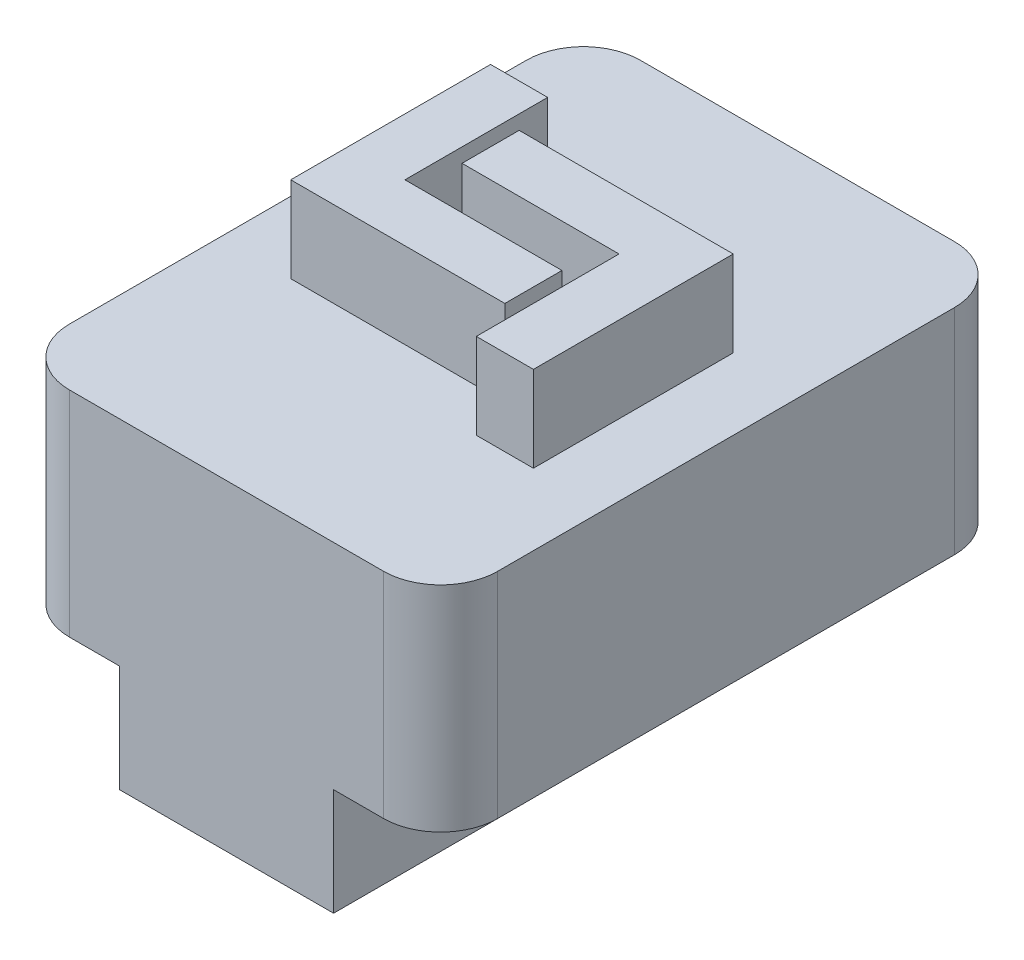
ISO-10303-21;
HEADER;
FILE_DESCRIPTION(('STEP AP214'),'2;1');
FILE_NAME('part.step','',(''),(''),'','','');
FILE_SCHEMA(('AUTOMOTIVE_DESIGN { 1 0 10303 214 1 1 1 1 }'));
ENDSEC;
DATA;
#1=APPLICATION_CONTEXT('core data for automotive mechanical design processes');
#2=APPLICATION_PROTOCOL_DEFINITION('international standard','automotive_design',2000,#1);
#3=PRODUCT_CONTEXT('',#1,'mechanical');
#4=PRODUCT('Part','Part','',(#3));
#5=PRODUCT_RELATED_PRODUCT_CATEGORY('part','',(#4));
#6=PRODUCT_DEFINITION_FORMATION('','',#4);
#7=PRODUCT_DEFINITION_CONTEXT('part definition',#1,'design');
#8=PRODUCT_DEFINITION('design','',#6,#7);
#9=PRODUCT_DEFINITION_SHAPE('','',#8);
#10=(LENGTH_UNIT() NAMED_UNIT(*) SI_UNIT(.MILLI.,.METRE.));
#11=(NAMED_UNIT(*) PLANE_ANGLE_UNIT() SI_UNIT($,.RADIAN.));
#12=(NAMED_UNIT(*) SI_UNIT($,.STERADIAN.) SOLID_ANGLE_UNIT());
#13=UNCERTAINTY_MEASURE_WITH_UNIT(LENGTH_MEASURE(1.E-05),#10,'distance_accuracy_value','');
#14=(GEOMETRIC_REPRESENTATION_CONTEXT(3) GLOBAL_UNCERTAINTY_ASSIGNED_CONTEXT((#13)) GLOBAL_UNIT_ASSIGNED_CONTEXT((#10,
#11,#12)) REPRESENTATION_CONTEXT('',''));
#15=CARTESIAN_POINT('',(0.,0.,0.));
#16=DIRECTION('',(0.,0.,1.));
#17=DIRECTION('',(1.,0.,0.));
#18=AXIS2_PLACEMENT_3D('',#15,#16,#17);
#19=CARTESIAN_POINT('',(0.,0.,80.));
#20=DIRECTION('',(1.,0.,0.));
#21=DIRECTION('',(0.,0.,-1.));
#22=AXIS2_PLACEMENT_3D('',#19,#20,#21);
#23=PLANE('',#22);
#24=DIRECTION('',(0.,-1.,0.));
#25=VECTOR('',#24,1.);
#26=CARTESIAN_POINT('',(0.,0.,7.99999999999999));
#27=LINE('',#26,#25);
#28=CARTESIAN_POINT('',(0.,45.,7.99999999999999));
#29=VERTEX_POINT('',#28);
#30=CARTESIAN_POINT('',(0.,15.,7.99999999999999));
#31=VERTEX_POINT('',#30);
#32=EDGE_CURVE('E416',#29,#31,#27,.T.);
#33=ORIENTED_EDGE('',*,*,#32,.T.);
#34=DIRECTION('',(0.,0.,1.));
#35=VECTOR('',#34,1.);
#36=CARTESIAN_POINT('',(0.,15.,0.));
#37=LINE('',#36,#35);
#38=CARTESIAN_POINT('',(0.,15.,72.));
#39=VERTEX_POINT('',#38);
#40=EDGE_CURVE('E369',#31,#39,#37,.T.);
#41=ORIENTED_EDGE('',*,*,#40,.T.);
#42=DIRECTION('',(0.,-1.,0.));
#43=VECTOR('',#42,1.);
#44=CARTESIAN_POINT('',(0.,0.,72.));
#45=LINE('',#44,#43);
#46=CARTESIAN_POINT('',(0.,45.,72.));
#47=VERTEX_POINT('',#46);
#48=EDGE_CURVE('E414',#39,#47,#45,.F.);
#49=ORIENTED_EDGE('',*,*,#48,.T.);
#50=DIRECTION('',(0.,0.,-1.));
#51=VECTOR('',#50,1.);
#52=CARTESIAN_POINT('',(0.,45.,80.));
#53=LINE('',#52,#51);
#54=EDGE_CURVE('E408',#47,#29,#53,.T.);
#55=ORIENTED_EDGE('',*,*,#54,.T.);
#56=EDGE_LOOP('',(#33,#41,#49,#55));
#57=FACE_BOUND('',#56,.T.);
#58=ADVANCED_FACE('F84',(#57),#23,.F.);
#59=CARTESIAN_POINT('',(0.,0.,80.));
#60=DIRECTION('',(0.,1.,0.));
#61=DIRECTION('',(0.,0.,1.));
#62=AXIS2_PLACEMENT_3D('',#59,#60,#61);
#63=PLANE('',#62);
#64=CARTESIAN_POINT('',(18.8630681963119,0.,28.8630681963119));
#65=DIRECTION('',(0.,-1.,0.));
#66=DIRECTION('',(0.,0.,-1.));
#67=AXIS2_PLACEMENT_3D('',#64,#65,#66);
#68=CIRCLE('',#67,2.5);
#69=CARTESIAN_POINT('',(18.8630681963119,0.,26.3630681963119));
#70=VERTEX_POINT('',#69);
#71=EDGE_CURVE('E333',#70,#70,#68,.T.);
#72=ORIENTED_EDGE('',*,*,#71,.F.);
#73=EDGE_LOOP('',(#72));
#74=FACE_BOUND('',#73,.T.);
#75=CARTESIAN_POINT('',(18.8630681963119,0.,51.1369318036881));
#76=DIRECTION('',(0.,-1.,0.));
#77=DIRECTION('',(0.,0.,-1.));
#78=AXIS2_PLACEMENT_3D('',#75,#76,#77);
#79=CIRCLE('',#78,2.5);
#80=CARTESIAN_POINT('',(18.8630681963119,0.,48.6369318036881));
#81=VERTEX_POINT('',#80);
#82=EDGE_CURVE('E339',#81,#81,#79,.T.);
#83=ORIENTED_EDGE('',*,*,#82,.F.);
#84=EDGE_LOOP('',(#83));
#85=FACE_BOUND('',#84,.T.);
#86=CARTESIAN_POINT('',(41.1369318036881,0.,28.8630681963119));
#87=DIRECTION('',(0.,-1.,0.));
#88=DIRECTION('',(0.,0.,-1.));
#89=AXIS2_PLACEMENT_3D('',#86,#87,#88);
#90=CIRCLE('',#89,2.49999999999999);
#91=CARTESIAN_POINT('',(41.1369318036881,0.,26.3630681963119));
#92=VERTEX_POINT('',#91);
#93=EDGE_CURVE('E345',#92,#92,#90,.T.);
#94=ORIENTED_EDGE('',*,*,#93,.F.);
#95=EDGE_LOOP('',(#94));
#96=FACE_BOUND('',#95,.T.);
#97=CARTESIAN_POINT('',(41.1369318036881,0.,51.1369318036881));
#98=DIRECTION('',(0.,-1.,0.));
#99=DIRECTION('',(0.,0.,-1.));
#100=AXIS2_PLACEMENT_3D('',#97,#98,#99);
#101=CIRCLE('',#100,2.5);
#102=CARTESIAN_POINT('',(41.1369318036881,0.,48.6369318036881));
#103=VERTEX_POINT('',#102);
#104=EDGE_CURVE('E351',#103,#103,#101,.T.);
#105=ORIENTED_EDGE('',*,*,#104,.F.);
#106=EDGE_LOOP('',(#105));
#107=FACE_BOUND('',#106,.T.);
#108=DIRECTION('',(1.,0.,0.));
#109=VECTOR('',#108,1.);
#110=CARTESIAN_POINT('',(0.,0.,80.));
#111=LINE('',#110,#109);
#112=CARTESIAN_POINT('',(15.,0.,80.));
#113=VERTEX_POINT('',#112);
#114=CARTESIAN_POINT('',(45.,0.,80.));
#115=VERTEX_POINT('',#114);
#116=EDGE_CURVE('E403',#113,#115,#111,.T.);
#117=ORIENTED_EDGE('',*,*,#116,.F.);
#118=DIRECTION('',(0.,0.,1.));
#119=VECTOR('',#118,1.);
#120=CARTESIAN_POINT('',(15.,0.,0.));
#121=LINE('',#120,#119);
#122=CARTESIAN_POINT('',(15.,0.,0.));
#123=VERTEX_POINT('',#122);
#124=EDGE_CURVE('E368',#123,#113,#121,.T.);
#125=ORIENTED_EDGE('',*,*,#124,.F.);
#126=DIRECTION('',(1.,0.,0.));
#127=VECTOR('',#126,1.);
#128=CARTESIAN_POINT('',(0.,0.,0.));
#129=LINE('',#128,#127);
#130=CARTESIAN_POINT('',(45.,0.,0.));
#131=VERTEX_POINT('',#130);
#132=EDGE_CURVE('E398',#123,#131,#129,.T.);
#133=ORIENTED_EDGE('',*,*,#132,.T.);
#134=DIRECTION('',(0.,0.,1.));
#135=VECTOR('',#134,1.);
#136=CARTESIAN_POINT('',(45.,0.,0.));
#137=LINE('',#136,#135);
#138=EDGE_CURVE('E388',#131,#115,#137,.T.);
#139=ORIENTED_EDGE('',*,*,#138,.T.);
#140=EDGE_LOOP('',(#117,#125,#133,#139));
#141=FACE_BOUND('',#140,.T.);
#142=ADVANCED_FACE('F486',(#74,#85,#96,#107,#141),#63,.F.);
#143=CARTESIAN_POINT('',(60.,0.,80.));
#144=DIRECTION('',(-1.,0.,0.));
#145=DIRECTION('',(0.,0.,1.));
#146=AXIS2_PLACEMENT_3D('',#143,#144,#145);
#147=PLANE('',#146);
#148=DIRECTION('',(0.,1.,0.));
#149=VECTOR('',#148,1.);
#150=CARTESIAN_POINT('',(60.,0.,72.));
#151=LINE('',#150,#149);
#152=CARTESIAN_POINT('',(60.,45.,72.));
#153=VERTEX_POINT('',#152);
#154=CARTESIAN_POINT('',(60.,15.,72.));
#155=VERTEX_POINT('',#154);
#156=EDGE_CURVE('E432',#153,#155,#151,.F.);
#157=ORIENTED_EDGE('',*,*,#156,.T.);
#158=DIRECTION('',(0.,0.,1.));
#159=VECTOR('',#158,1.);
#160=CARTESIAN_POINT('',(60.,15.,0.));
#161=LINE('',#160,#159);
#162=CARTESIAN_POINT('',(60.,15.,7.99999999999999));
#163=VERTEX_POINT('',#162);
#164=EDGE_CURVE('E393',#163,#155,#161,.T.);
#165=ORIENTED_EDGE('',*,*,#164,.F.);
#166=DIRECTION('',(0.,1.,0.));
#167=VECTOR('',#166,1.);
#168=CARTESIAN_POINT('',(60.,45.,7.99999999999999));
#169=LINE('',#168,#167);
#170=CARTESIAN_POINT('',(60.,45.,7.99999999999999));
#171=VERTEX_POINT('',#170);
#172=EDGE_CURVE('E435',#163,#171,#169,.T.);
#173=ORIENTED_EDGE('',*,*,#172,.T.);
#174=DIRECTION('',(0.,0.,-1.));
#175=VECTOR('',#174,1.);
#176=CARTESIAN_POINT('',(60.,45.,80.));
#177=LINE('',#176,#175);
#178=EDGE_CURVE('E411',#153,#171,#177,.T.);
#179=ORIENTED_EDGE('',*,*,#178,.F.);
#180=EDGE_LOOP('',(#157,#165,#173,#179));
#181=FACE_BOUND('',#180,.T.);
#182=ADVANCED_FACE('F498',(#181),#147,.F.);
#183=CARTESIAN_POINT('',(0.,45.,80.));
#184=DIRECTION('',(0.,-1.,0.));
#185=DIRECTION('',(0.,0.,-1.));
#186=AXIS2_PLACEMENT_3D('',#183,#184,#185);
#187=PLANE('',#186);
#188=DIRECTION('',(0.,0.,1.));
#189=VECTOR('',#188,1.);
#190=CARTESIAN_POINT('',(50.,45.,29.));
#191=LINE('',#190,#189);
#192=CARTESIAN_POINT('',(50.,45.,29.));
#193=VERTEX_POINT('',#192);
#194=CARTESIAN_POINT('',(50.,45.,57.));
#195=VERTEX_POINT('',#194);
#196=EDGE_CURVE('E103',#193,#195,#191,.T.);
#197=ORIENTED_EDGE('',*,*,#196,.T.);
#198=DIRECTION('',(-1.,0.,0.));
#199=VECTOR('',#198,1.);
#200=CARTESIAN_POINT('',(-47.9231672867576,45.,56.9999999999999));
#201=LINE('',#200,#199);
#202=CARTESIAN_POINT('',(42.,45.,57.));
#203=VERTEX_POINT('',#202);
#204=EDGE_CURVE('E98',#195,#203,#201,.T.);
#205=ORIENTED_EDGE('',*,*,#204,.T.);
#206=DIRECTION('',(0.,0.,1.));
#207=VECTOR('',#206,1.);
#208=CARTESIAN_POINT('',(42.,45.,40.));
#209=LINE('',#208,#207);
#210=CARTESIAN_POINT('',(42.,45.,37.));
#211=VERTEX_POINT('',#210);
#212=EDGE_CURVE('E270',#211,#203,#209,.T.);
#213=ORIENTED_EDGE('',*,*,#212,.F.);
#214=DIRECTION('',(1.,0.,0.));
#215=VECTOR('',#214,1.);
#216=CARTESIAN_POINT('',(20.,45.,37.));
#217=LINE('',#216,#215);
#218=CARTESIAN_POINT('',(20.,45.,37.));
#219=VERTEX_POINT('',#218);
#220=EDGE_CURVE('E274',#219,#211,#217,.T.);
#221=ORIENTED_EDGE('',*,*,#220,.F.);
#222=DIRECTION('',(0.,0.,1.));
#223=VECTOR('',#222,1.);
#224=CARTESIAN_POINT('',(20.,45.,29.));
#225=LINE('',#224,#223);
#226=CARTESIAN_POINT('',(20.,45.,29.));
#227=VERTEX_POINT('',#226);
#228=EDGE_CURVE('E282',#227,#219,#225,.T.);
#229=ORIENTED_EDGE('',*,*,#228,.F.);
#230=DIRECTION('',(1.,0.,0.));
#231=VECTOR('',#230,1.);
#232=CARTESIAN_POINT('',(20.,45.,29.));
#233=LINE('',#232,#231);
#234=EDGE_CURVE('E251',#227,#193,#233,.T.);
#235=ORIENTED_EDGE('',*,*,#234,.T.);
#236=EDGE_LOOP('',(#197,#205,#213,#221,#229,#235));
#237=FACE_BOUND('',#236,.T.);
#238=DIRECTION('',(1.,0.,0.));
#239=VECTOR('',#238,1.);
#240=CARTESIAN_POINT('',(-47.9231672867576,45.,51.));
#241=LINE('',#240,#239);
#242=CARTESIAN_POINT('',(10.,45.,51.));
#243=VERTEX_POINT('',#242);
#244=CARTESIAN_POINT('',(40.,45.,51.));
#245=VERTEX_POINT('',#244);
#246=EDGE_CURVE('E290',#243,#245,#241,.T.);
#247=ORIENTED_EDGE('',*,*,#246,.F.);
#248=DIRECTION('',(0.,0.,-1.));
#249=VECTOR('',#248,1.);
#250=CARTESIAN_POINT('',(10.,45.,40.));
#251=LINE('',#250,#249);
#252=CARTESIAN_POINT('',(10.,45.,23.));
#253=VERTEX_POINT('',#252);
#254=EDGE_CURVE('E287',#243,#253,#251,.T.);
#255=ORIENTED_EDGE('',*,*,#254,.T.);
#256=DIRECTION('',(1.,0.,0.));
#257=VECTOR('',#256,1.);
#258=CARTESIAN_POINT('',(-47.9231672867576,45.,23.));
#259=LINE('',#258,#257);
#260=CARTESIAN_POINT('',(18.,45.,23.));
#261=VERTEX_POINT('',#260);
#262=EDGE_CURVE('E301',#253,#261,#259,.T.);
#263=ORIENTED_EDGE('',*,*,#262,.T.);
#264=DIRECTION('',(0.,0.,-1.));
#265=VECTOR('',#264,1.);
#266=CARTESIAN_POINT('',(18.,45.,40.));
#267=LINE('',#266,#265);
#268=CARTESIAN_POINT('',(18.,45.,43.));
#269=VERTEX_POINT('',#268);
#270=EDGE_CURVE('E299',#269,#261,#267,.T.);
#271=ORIENTED_EDGE('',*,*,#270,.F.);
#272=DIRECTION('',(1.,0.,0.));
#273=VECTOR('',#272,1.);
#274=CARTESIAN_POINT('',(-47.9231672867576,45.,43.));
#275=LINE('',#274,#273);
#276=CARTESIAN_POINT('',(40.,45.,43.));
#277=VERTEX_POINT('',#276);
#278=EDGE_CURVE('E296',#269,#277,#275,.T.);
#279=ORIENTED_EDGE('',*,*,#278,.T.);
#280=DIRECTION('',(0.,0.,1.));
#281=VECTOR('',#280,1.);
#282=CARTESIAN_POINT('',(40.,45.,40.));
#283=LINE('',#282,#281);
#284=EDGE_CURVE('E293',#277,#245,#283,.T.);
#285=ORIENTED_EDGE('',*,*,#284,.T.);
#286=EDGE_LOOP('',(#247,#255,#263,#271,#279,#285));
#287=FACE_BOUND('',#286,.T.);
#288=DIRECTION('',(-1.,0.,0.));
#289=VECTOR('',#288,1.);
#290=CARTESIAN_POINT('',(0.,45.,0.));
#291=LINE('',#290,#289);
#292=CARTESIAN_POINT('',(52.,45.,0.));
#293=VERTEX_POINT('',#292);
#294=CARTESIAN_POINT('',(8.,45.,0.));
#295=VERTEX_POINT('',#294);
#296=EDGE_CURVE('E400',#293,#295,#291,.T.);
#297=ORIENTED_EDGE('',*,*,#296,.T.);
#298=CARTESIAN_POINT('',(8.,45.,7.99999999999999));
#299=DIRECTION('',(0.,-1.,0.));
#300=DIRECTION('',(0.,0.,-1.));
#301=AXIS2_PLACEMENT_3D('',#298,#299,#300);
#302=CIRCLE('',#301,8.);
#303=EDGE_CURVE('E430',#295,#29,#302,.F.);
#304=ORIENTED_EDGE('',*,*,#303,.T.);
#305=ORIENTED_EDGE('',*,*,#54,.F.);
#306=CARTESIAN_POINT('',(8.,45.,72.));
#307=DIRECTION('',(0.,-1.,0.));
#308=DIRECTION('',(0.,0.,-1.));
#309=AXIS2_PLACEMENT_3D('',#306,#307,#308);
#310=CIRCLE('',#309,8.);
#311=CARTESIAN_POINT('',(8.,45.,80.));
#312=VERTEX_POINT('',#311);
#313=EDGE_CURVE('E426',#47,#312,#310,.F.);
#314=ORIENTED_EDGE('',*,*,#313,.T.);
#315=DIRECTION('',(-1.,0.,0.));
#316=VECTOR('',#315,1.);
#317=CARTESIAN_POINT('',(0.,45.,80.));
#318=LINE('',#317,#316);
#319=CARTESIAN_POINT('',(52.,45.,80.));
#320=VERTEX_POINT('',#319);
#321=EDGE_CURVE('E405',#320,#312,#318,.T.);
#322=ORIENTED_EDGE('',*,*,#321,.F.);
#323=CARTESIAN_POINT('',(52.,45.,72.));
#324=DIRECTION('',(0.,-1.,0.));
#325=DIRECTION('',(0.,0.,-1.));
#326=AXIS2_PLACEMENT_3D('',#323,#324,#325);
#327=CIRCLE('',#326,8.);
#328=EDGE_CURVE('E424',#320,#153,#327,.F.);
#329=ORIENTED_EDGE('',*,*,#328,.T.);
#330=ORIENTED_EDGE('',*,*,#178,.T.);
#331=CARTESIAN_POINT('',(52.,45.,7.99999999999999));
#332=DIRECTION('',(0.,-1.,0.));
#333=DIRECTION('',(0.,0.,-1.));
#334=AXIS2_PLACEMENT_3D('',#331,#332,#333);
#335=CIRCLE('',#334,8.);
#336=EDGE_CURVE('E428',#171,#293,#335,.F.);
#337=ORIENTED_EDGE('',*,*,#336,.T.);
#338=EDGE_LOOP('',(#297,#304,#305,#314,#322,#329,#330,#337));
#339=FACE_BOUND('',#338,.T.);
#340=ADVANCED_FACE('F457',(#237,#287,#339),#187,.F.);
#341=CARTESIAN_POINT('',(0.,45.,80.));
#342=DIRECTION('',(0.,0.,-1.));
#343=DIRECTION('',(-1.,0.,0.));
#344=AXIS2_PLACEMENT_3D('',#341,#342,#343);
#345=PLANE('',#344);
#346=DIRECTION('',(0.,-1.,0.));
#347=VECTOR('',#346,1.);
#348=CARTESIAN_POINT('',(8.,45.,80.));
#349=LINE('',#348,#347);
#350=CARTESIAN_POINT('',(8.,15.,80.));
#351=VERTEX_POINT('',#350);
#352=EDGE_CURVE('E439',#312,#351,#349,.T.);
#353=ORIENTED_EDGE('',*,*,#352,.T.);
#354=DIRECTION('',(-1.,0.,0.));
#355=VECTOR('',#354,1.);
#356=CARTESIAN_POINT('',(0.,15.,80.));
#357=LINE('',#356,#355);
#358=CARTESIAN_POINT('',(15.,15.,80.));
#359=VERTEX_POINT('',#358);
#360=EDGE_CURVE('E360',#359,#351,#357,.T.);
#361=ORIENTED_EDGE('',*,*,#360,.F.);
#362=DIRECTION('',(0.,1.,0.));
#363=VECTOR('',#362,1.);
#364=CARTESIAN_POINT('',(15.,0.,80.));
#365=LINE('',#364,#363);
#366=EDGE_CURVE('E357',#113,#359,#365,.T.);
#367=ORIENTED_EDGE('',*,*,#366,.F.);
#368=ORIENTED_EDGE('',*,*,#116,.T.);
#369=DIRECTION('',(0.,-1.,0.));
#370=VECTOR('',#369,1.);
#371=CARTESIAN_POINT('',(45.,15.,80.));
#372=LINE('',#371,#370);
#373=CARTESIAN_POINT('',(45.,15.,80.));
#374=VERTEX_POINT('',#373);
#375=EDGE_CURVE('E377',#374,#115,#372,.T.);
#376=ORIENTED_EDGE('',*,*,#375,.F.);
#377=DIRECTION('',(-1.,0.,0.));
#378=VECTOR('',#377,1.);
#379=CARTESIAN_POINT('',(45.,15.,80.));
#380=LINE('',#379,#378);
#381=CARTESIAN_POINT('',(52.,15.,80.));
#382=VERTEX_POINT('',#381);
#383=EDGE_CURVE('E380',#382,#374,#380,.T.);
#384=ORIENTED_EDGE('',*,*,#383,.F.);
#385=DIRECTION('',(0.,1.,0.));
#386=VECTOR('',#385,1.);
#387=CARTESIAN_POINT('',(52.,45.,80.));
#388=LINE('',#387,#386);
#389=EDGE_CURVE('E437',#382,#320,#388,.T.);
#390=ORIENTED_EDGE('',*,*,#389,.T.);
#391=ORIENTED_EDGE('',*,*,#321,.T.);
#392=EDGE_LOOP('',(#353,#361,#367,#368,#376,#384,#390,#391));
#393=FACE_BOUND('',#392,.T.);
#394=ADVANCED_FACE('F451',(#393),#345,.F.);
#395=CARTESIAN_POINT('',(0.,45.,0.));
#396=DIRECTION('',(0.,0.,-1.));
#397=DIRECTION('',(-1.,0.,0.));
#398=AXIS2_PLACEMENT_3D('',#395,#396,#397);
#399=PLANE('',#398);
#400=DIRECTION('',(-1.,0.,0.));
#401=VECTOR('',#400,1.);
#402=CARTESIAN_POINT('',(0.,15.,0.));
#403=LINE('',#402,#401);
#404=CARTESIAN_POINT('',(15.,15.,0.));
#405=VERTEX_POINT('',#404);
#406=CARTESIAN_POINT('',(8.,15.,0.));
#407=VERTEX_POINT('',#406);
#408=EDGE_CURVE('E365',#405,#407,#403,.T.);
#409=ORIENTED_EDGE('',*,*,#408,.T.);
#410=DIRECTION('',(0.,-1.,0.));
#411=VECTOR('',#410,1.);
#412=CARTESIAN_POINT('',(8.,45.,0.));
#413=LINE('',#412,#411);
#414=EDGE_CURVE('E422',#407,#295,#413,.F.);
#415=ORIENTED_EDGE('',*,*,#414,.T.);
#416=ORIENTED_EDGE('',*,*,#296,.F.);
#417=DIRECTION('',(0.,1.,0.));
#418=VECTOR('',#417,1.);
#419=CARTESIAN_POINT('',(52.,0.,0.));
#420=LINE('',#419,#418);
#421=CARTESIAN_POINT('',(52.,15.,0.));
#422=VERTEX_POINT('',#421);
#423=EDGE_CURVE('E419',#293,#422,#420,.F.);
#424=ORIENTED_EDGE('',*,*,#423,.T.);
#425=DIRECTION('',(-1.,0.,0.));
#426=VECTOR('',#425,1.);
#427=CARTESIAN_POINT('',(45.,15.,0.));
#428=LINE('',#427,#426);
#429=CARTESIAN_POINT('',(45.,15.,0.));
#430=VERTEX_POINT('',#429);
#431=EDGE_CURVE('E385',#422,#430,#428,.T.);
#432=ORIENTED_EDGE('',*,*,#431,.T.);
#433=DIRECTION('',(0.,-1.,0.));
#434=VECTOR('',#433,1.);
#435=CARTESIAN_POINT('',(45.,15.,0.));
#436=LINE('',#435,#434);
#437=EDGE_CURVE('E382',#430,#131,#436,.T.);
#438=ORIENTED_EDGE('',*,*,#437,.T.);
#439=ORIENTED_EDGE('',*,*,#132,.F.);
#440=DIRECTION('',(0.,1.,0.));
#441=VECTOR('',#440,1.);
#442=CARTESIAN_POINT('',(15.,0.,0.));
#443=LINE('',#442,#441);
#444=EDGE_CURVE('E362',#123,#405,#443,.T.);
#445=ORIENTED_EDGE('',*,*,#444,.T.);
#446=EDGE_LOOP('',(#409,#415,#416,#424,#432,#438,#439,#445));
#447=FACE_BOUND('',#446,.T.);
#448=ADVANCED_FACE('F477',(#447),#399,.T.);
#449=CARTESIAN_POINT('',(8.,0.,7.99999999999999));
#450=DIRECTION('',(0.,1.,0.));
#451=DIRECTION('',(0.,0.,1.));
#452=AXIS2_PLACEMENT_3D('',#449,#450,#451);
#453=CYLINDRICAL_SURFACE('',#452,8.);
#454=CARTESIAN_POINT('',(8.,15.,7.99999999999999));
#455=DIRECTION('',(0.,1.,0.));
#456=DIRECTION('',(0.,0.,1.));
#457=AXIS2_PLACEMENT_3D('',#454,#455,#456);
#458=CIRCLE('',#457,8.);
#459=EDGE_CURVE('E372',#31,#407,#458,.F.);
#460=ORIENTED_EDGE('',*,*,#459,.F.);
#461=ORIENTED_EDGE('',*,*,#32,.F.);
#462=ORIENTED_EDGE('',*,*,#303,.F.);
#463=ORIENTED_EDGE('',*,*,#414,.F.);
#464=EDGE_LOOP('',(#460,#461,#462,#463));
#465=FACE_BOUND('',#464,.T.);
#466=ADVANCED_FACE('F473',(#465),#453,.T.);
#467=CARTESIAN_POINT('',(52.,0.,7.99999999999999));
#468=DIRECTION('',(0.,-1.,0.));
#469=DIRECTION('',(0.,0.,-1.));
#470=AXIS2_PLACEMENT_3D('',#467,#468,#469);
#471=CYLINDRICAL_SURFACE('',#470,8.);
#472=CARTESIAN_POINT('',(52.,15.,7.99999999999999));
#473=DIRECTION('',(0.,1.,0.));
#474=DIRECTION('',(0.,0.,1.));
#475=AXIS2_PLACEMENT_3D('',#472,#473,#474);
#476=CIRCLE('',#475,8.);
#477=EDGE_CURVE('E392',#422,#163,#476,.F.);
#478=ORIENTED_EDGE('',*,*,#477,.F.);
#479=ORIENTED_EDGE('',*,*,#423,.F.);
#480=ORIENTED_EDGE('',*,*,#336,.F.);
#481=ORIENTED_EDGE('',*,*,#172,.F.);
#482=EDGE_LOOP('',(#478,#479,#480,#481));
#483=FACE_BOUND('',#482,.T.);
#484=ADVANCED_FACE('F495',(#483),#471,.T.);
#485=CARTESIAN_POINT('',(8.,45.,72.));
#486=DIRECTION('',(0.,-1.,0.));
#487=DIRECTION('',(0.,0.,-1.));
#488=AXIS2_PLACEMENT_3D('',#485,#486,#487);
#489=CYLINDRICAL_SURFACE('',#488,8.);
#490=CARTESIAN_POINT('',(8.,15.,72.));
#491=DIRECTION('',(0.,1.,0.));
#492=DIRECTION('',(0.,0.,1.));
#493=AXIS2_PLACEMENT_3D('',#490,#491,#492);
#494=CIRCLE('',#493,8.);
#495=EDGE_CURVE('E12',#351,#39,#494,.F.);
#496=ORIENTED_EDGE('',*,*,#495,.F.);
#497=ORIENTED_EDGE('',*,*,#352,.F.);
#498=ORIENTED_EDGE('',*,*,#313,.F.);
#499=ORIENTED_EDGE('',*,*,#48,.F.);
#500=EDGE_LOOP('',(#496,#497,#498,#499));
#501=FACE_BOUND('',#500,.T.);
#502=ADVANCED_FACE('F464',(#501),#489,.T.);
#503=CARTESIAN_POINT('',(52.,45.,72.));
#504=DIRECTION('',(0.,1.,0.));
#505=DIRECTION('',(0.,0.,1.));
#506=AXIS2_PLACEMENT_3D('',#503,#504,#505);
#507=CYLINDRICAL_SURFACE('',#506,8.);
#508=CARTESIAN_POINT('',(52.,15.,72.));
#509=DIRECTION('',(0.,1.,0.));
#510=DIRECTION('',(0.,0.,1.));
#511=AXIS2_PLACEMENT_3D('',#508,#509,#510);
#512=CIRCLE('',#511,8.);
#513=EDGE_CURVE('E91',#155,#382,#512,.F.);
#514=ORIENTED_EDGE('',*,*,#513,.F.);
#515=ORIENTED_EDGE('',*,*,#156,.F.);
#516=ORIENTED_EDGE('',*,*,#328,.F.);
#517=ORIENTED_EDGE('',*,*,#389,.F.);
#518=EDGE_LOOP('',(#514,#515,#516,#517));
#519=FACE_BOUND('',#518,.T.);
#520=ADVANCED_FACE('F453',(#519),#507,.T.);
#521=CARTESIAN_POINT('',(45.,15.,0.));
#522=DIRECTION('',(-1.,0.,0.));
#523=DIRECTION('',(0.,0.,1.));
#524=AXIS2_PLACEMENT_3D('',#521,#522,#523);
#525=PLANE('',#524);
#526=ORIENTED_EDGE('',*,*,#375,.T.);
#527=ORIENTED_EDGE('',*,*,#138,.F.);
#528=ORIENTED_EDGE('',*,*,#437,.F.);
#529=DIRECTION('',(0.,0.,1.));
#530=VECTOR('',#529,1.);
#531=CARTESIAN_POINT('',(45.,15.,0.));
#532=LINE('',#531,#530);
#533=EDGE_CURVE('E389',#430,#374,#532,.T.);
#534=ORIENTED_EDGE('',*,*,#533,.T.);
#535=EDGE_LOOP('',(#526,#527,#528,#534));
#536=FACE_BOUND('',#535,.T.);
#537=ADVANCED_FACE('F489',(#536),#525,.F.);
#538=CARTESIAN_POINT('',(45.,15.,0.));
#539=DIRECTION('',(0.,1.,0.));
#540=DIRECTION('',(0.,0.,1.));
#541=AXIS2_PLACEMENT_3D('',#538,#539,#540);
#542=PLANE('',#541);
#543=ORIENTED_EDGE('',*,*,#477,.T.);
#544=ORIENTED_EDGE('',*,*,#164,.T.);
#545=ORIENTED_EDGE('',*,*,#513,.T.);
#546=ORIENTED_EDGE('',*,*,#383,.T.);
#547=ORIENTED_EDGE('',*,*,#533,.F.);
#548=ORIENTED_EDGE('',*,*,#431,.F.);
#549=EDGE_LOOP('',(#543,#544,#545,#546,#547,#548));
#550=FACE_BOUND('',#549,.T.);
#551=ADVANCED_FACE('F444',(#550),#542,.F.);
#552=CARTESIAN_POINT('',(0.,15.,0.));
#553=DIRECTION('',(0.,1.,0.));
#554=DIRECTION('',(0.,0.,1.));
#555=AXIS2_PLACEMENT_3D('',#552,#553,#554);
#556=PLANE('',#555);
#557=ORIENTED_EDGE('',*,*,#459,.T.);
#558=ORIENTED_EDGE('',*,*,#408,.F.);
#559=DIRECTION('',(0.,0.,1.));
#560=VECTOR('',#559,1.);
#561=CARTESIAN_POINT('',(15.,15.,0.));
#562=LINE('',#561,#560);
#563=EDGE_CURVE('E373',#405,#359,#562,.T.);
#564=ORIENTED_EDGE('',*,*,#563,.T.);
#565=ORIENTED_EDGE('',*,*,#360,.T.);
#566=ORIENTED_EDGE('',*,*,#495,.T.);
#567=ORIENTED_EDGE('',*,*,#40,.F.);
#568=EDGE_LOOP('',(#557,#558,#564,#565,#566,#567));
#569=FACE_BOUND('',#568,.T.);
#570=ADVANCED_FACE('F467',(#569),#556,.F.);
#571=CARTESIAN_POINT('',(15.,0.,0.));
#572=DIRECTION('',(1.,0.,0.));
#573=DIRECTION('',(0.,1.,0.));
#574=AXIS2_PLACEMENT_3D('',#571,#572,#573);
#575=PLANE('',#574);
#576=ORIENTED_EDGE('',*,*,#366,.T.);
#577=ORIENTED_EDGE('',*,*,#563,.F.);
#578=ORIENTED_EDGE('',*,*,#444,.F.);
#579=ORIENTED_EDGE('',*,*,#124,.T.);
#580=EDGE_LOOP('',(#576,#577,#578,#579));
#581=FACE_BOUND('',#580,.T.);
#582=ADVANCED_FACE('F482',(#581),#575,.F.);
#583=CARTESIAN_POINT('',(41.1369318036881,5.,51.1369318036881));
#584=DIRECTION('',(0.,-1.,0.));
#585=DIRECTION('',(0.,0.,-1.));
#586=AXIS2_PLACEMENT_3D('',#583,#584,#585);
#587=CYLINDRICAL_SURFACE('',#586,2.5);
#588=CARTESIAN_POINT('',(41.1369318036881,5.,51.1369318036881));
#589=DIRECTION('',(0.,-1.,0.));
#590=DIRECTION('',(0.,0.,-1.));
#591=AXIS2_PLACEMENT_3D('',#588,#589,#590);
#592=CIRCLE('',#591,2.5);
#593=CARTESIAN_POINT('',(41.1369318036881,5.,48.6369318036881));
#594=VERTEX_POINT('',#593);
#595=EDGE_CURVE('E354',#594,#594,#592,.T.);
#596=ORIENTED_EDGE('',*,*,#595,.F.);
#597=EDGE_LOOP('',(#596));
#598=FACE_BOUND('',#597,.T.);
#599=ORIENTED_EDGE('',*,*,#104,.T.);
#600=EDGE_LOOP('',(#599));
#601=FACE_BOUND('',#600,.T.);
#602=ADVANCED_FACE('F525',(#598,#601),#587,.F.);
#603=CARTESIAN_POINT('',(41.1369318036881,5.,51.1369318036881));
#604=DIRECTION('',(0.,-1.,0.));
#605=DIRECTION('',(0.,0.,-1.));
#606=AXIS2_PLACEMENT_3D('',#603,#604,#605);
#607=PLANE('',#606);
#608=ORIENTED_EDGE('',*,*,#595,.T.);
#609=EDGE_LOOP('',(#608));
#610=FACE_BOUND('',#609,.T.);
#611=ADVANCED_FACE('F530',(#610),#607,.T.);
#612=CARTESIAN_POINT('',(41.1369318036881,5.,28.8630681963119));
#613=DIRECTION('',(0.,-1.,0.));
#614=DIRECTION('',(0.,0.,-1.));
#615=AXIS2_PLACEMENT_3D('',#612,#613,#614);
#616=CYLINDRICAL_SURFACE('',#615,2.49999999999999);
#617=CARTESIAN_POINT('',(41.1369318036881,5.,28.8630681963119));
#618=DIRECTION('',(0.,-1.,0.));
#619=DIRECTION('',(0.,0.,-1.));
#620=AXIS2_PLACEMENT_3D('',#617,#618,#619);
#621=CIRCLE('',#620,2.49999999999999);
#622=CARTESIAN_POINT('',(41.1369318036881,5.,26.3630681963119));
#623=VERTEX_POINT('',#622);
#624=EDGE_CURVE('E348',#623,#623,#621,.T.);
#625=ORIENTED_EDGE('',*,*,#624,.F.);
#626=EDGE_LOOP('',(#625));
#627=FACE_BOUND('',#626,.T.);
#628=ORIENTED_EDGE('',*,*,#93,.T.);
#629=EDGE_LOOP('',(#628));
#630=FACE_BOUND('',#629,.T.);
#631=ADVANCED_FACE('F540',(#627,#630),#616,.F.);
#632=CARTESIAN_POINT('',(41.1369318036881,5.,28.8630681963119));
#633=DIRECTION('',(0.,-1.,0.));
#634=DIRECTION('',(0.,0.,-1.));
#635=AXIS2_PLACEMENT_3D('',#632,#633,#634);
#636=PLANE('',#635);
#637=ORIENTED_EDGE('',*,*,#624,.T.);
#638=EDGE_LOOP('',(#637));
#639=FACE_BOUND('',#638,.T.);
#640=ADVANCED_FACE('F550',(#639),#636,.T.);
#641=CARTESIAN_POINT('',(18.8630681963119,5.,51.1369318036881));
#642=DIRECTION('',(0.,-1.,0.));
#643=DIRECTION('',(0.,0.,-1.));
#644=AXIS2_PLACEMENT_3D('',#641,#642,#643);
#645=CYLINDRICAL_SURFACE('',#644,2.5);
#646=CARTESIAN_POINT('',(18.8630681963119,5.,51.1369318036881));
#647=DIRECTION('',(0.,-1.,0.));
#648=DIRECTION('',(0.,0.,-1.));
#649=AXIS2_PLACEMENT_3D('',#646,#647,#648);
#650=CIRCLE('',#649,2.5);
#651=CARTESIAN_POINT('',(18.8630681963119,5.,48.6369318036881));
#652=VERTEX_POINT('',#651);
#653=EDGE_CURVE('E342',#652,#652,#650,.T.);
#654=ORIENTED_EDGE('',*,*,#653,.F.);
#655=EDGE_LOOP('',(#654));
#656=FACE_BOUND('',#655,.T.);
#657=ORIENTED_EDGE('',*,*,#82,.T.);
#658=EDGE_LOOP('',(#657));
#659=FACE_BOUND('',#658,.T.);
#660=ADVANCED_FACE('F560',(#656,#659),#645,.F.);
#661=CARTESIAN_POINT('',(18.8630681963119,5.,51.1369318036881));
#662=DIRECTION('',(0.,-1.,0.));
#663=DIRECTION('',(0.,0.,-1.));
#664=AXIS2_PLACEMENT_3D('',#661,#662,#663);
#665=PLANE('',#664);
#666=ORIENTED_EDGE('',*,*,#653,.T.);
#667=EDGE_LOOP('',(#666));
#668=FACE_BOUND('',#667,.T.);
#669=ADVANCED_FACE('F570',(#668),#665,.T.);
#670=CARTESIAN_POINT('',(18.8630681963119,5.,28.8630681963119));
#671=DIRECTION('',(0.,-1.,0.));
#672=DIRECTION('',(0.,0.,-1.));
#673=AXIS2_PLACEMENT_3D('',#670,#671,#672);
#674=CYLINDRICAL_SURFACE('',#673,2.5);
#675=CARTESIAN_POINT('',(18.8630681963119,5.,28.8630681963119));
#676=DIRECTION('',(0.,-1.,0.));
#677=DIRECTION('',(0.,0.,-1.));
#678=AXIS2_PLACEMENT_3D('',#675,#676,#677);
#679=CIRCLE('',#678,2.5);
#680=CARTESIAN_POINT('',(18.8630681963119,5.,26.3630681963119));
#681=VERTEX_POINT('',#680);
#682=EDGE_CURVE('E336',#681,#681,#679,.T.);
#683=ORIENTED_EDGE('',*,*,#682,.F.);
#684=EDGE_LOOP('',(#683));
#685=FACE_BOUND('',#684,.T.);
#686=ORIENTED_EDGE('',*,*,#71,.T.);
#687=EDGE_LOOP('',(#686));
#688=FACE_BOUND('',#687,.T.);
#689=ADVANCED_FACE('F580',(#685,#688),#674,.F.);
#690=CARTESIAN_POINT('',(18.8630681963119,5.,28.8630681963119));
#691=DIRECTION('',(0.,-1.,0.));
#692=DIRECTION('',(0.,0.,-1.));
#693=AXIS2_PLACEMENT_3D('',#690,#691,#692);
#694=PLANE('',#693);
#695=ORIENTED_EDGE('',*,*,#682,.T.);
#696=EDGE_LOOP('',(#695));
#697=FACE_BOUND('',#696,.T.);
#698=ADVANCED_FACE('F590',(#697),#694,.T.);
#699=CARTESIAN_POINT('',(10.,57.,40.));
#700=DIRECTION('',(-1.,0.,0.));
#701=DIRECTION('',(0.,0.,1.));
#702=AXIS2_PLACEMENT_3D('',#699,#700,#701);
#703=PLANE('',#702);
#704=ORIENTED_EDGE('',*,*,#254,.F.);
#705=DIRECTION('',(0.,-1.,0.));
#706=VECTOR('',#705,1.);
#707=CARTESIAN_POINT('',(10.,57.,51.));
#708=LINE('',#707,#706);
#709=CARTESIAN_POINT('',(10.,57.,51.));
#710=VERTEX_POINT('',#709);
#711=EDGE_CURVE('E331',#710,#243,#708,.T.);
#712=ORIENTED_EDGE('',*,*,#711,.F.);
#713=DIRECTION('',(0.,0.,-1.));
#714=VECTOR('',#713,1.);
#715=CARTESIAN_POINT('',(10.,57.,40.));
#716=LINE('',#715,#714);
#717=CARTESIAN_POINT('',(10.,57.,23.));
#718=VERTEX_POINT('',#717);
#719=EDGE_CURVE('E304',#710,#718,#716,.T.);
#720=ORIENTED_EDGE('',*,*,#719,.T.);
#721=DIRECTION('',(0.,-1.,0.));
#722=VECTOR('',#721,1.);
#723=CARTESIAN_POINT('',(10.,57.,23.));
#724=LINE('',#723,#722);
#725=EDGE_CURVE('E320',#718,#253,#724,.T.);
#726=ORIENTED_EDGE('',*,*,#725,.T.);
#727=EDGE_LOOP('',(#704,#712,#720,#726));
#728=FACE_BOUND('',#727,.T.);
#729=ADVANCED_FACE('F600',(#728),#703,.T.);
#730=CARTESIAN_POINT('',(-47.9231672867576,57.,51.));
#731=DIRECTION('',(0.,0.,-1.));
#732=DIRECTION('',(-1.,0.,0.));
#733=AXIS2_PLACEMENT_3D('',#730,#731,#732);
#734=PLANE('',#733);
#735=ORIENTED_EDGE('',*,*,#246,.T.);
#736=DIRECTION('',(0.,-1.,0.));
#737=VECTOR('',#736,1.);
#738=CARTESIAN_POINT('',(40.,57.,51.));
#739=LINE('',#738,#737);
#740=CARTESIAN_POINT('',(40.,57.,51.));
#741=VERTEX_POINT('',#740);
#742=EDGE_CURVE('E329',#741,#245,#739,.T.);
#743=ORIENTED_EDGE('',*,*,#742,.F.);
#744=DIRECTION('',(1.,0.,0.));
#745=VECTOR('',#744,1.);
#746=CARTESIAN_POINT('',(-47.9231672867576,57.,51.));
#747=LINE('',#746,#745);
#748=EDGE_CURVE('E307',#710,#741,#747,.T.);
#749=ORIENTED_EDGE('',*,*,#748,.F.);
#750=ORIENTED_EDGE('',*,*,#711,.T.);
#751=EDGE_LOOP('',(#735,#743,#749,#750));
#752=FACE_BOUND('',#751,.T.);
#753=ADVANCED_FACE('F619',(#752),#734,.F.);
#754=CARTESIAN_POINT('',(40.,57.,40.));
#755=DIRECTION('',(1.,0.,0.));
#756=DIRECTION('',(0.,0.,-1.));
#757=AXIS2_PLACEMENT_3D('',#754,#755,#756);
#758=PLANE('',#757);
#759=ORIENTED_EDGE('',*,*,#284,.F.);
#760=DIRECTION('',(0.,-1.,0.));
#761=VECTOR('',#760,1.);
#762=CARTESIAN_POINT('',(40.,57.,43.));
#763=LINE('',#762,#761);
#764=CARTESIAN_POINT('',(40.,57.,43.));
#765=VERTEX_POINT('',#764);
#766=EDGE_CURVE('E327',#765,#277,#763,.T.);
#767=ORIENTED_EDGE('',*,*,#766,.F.);
#768=DIRECTION('',(0.,0.,1.));
#769=VECTOR('',#768,1.);
#770=CARTESIAN_POINT('',(40.,57.,40.));
#771=LINE('',#770,#769);
#772=EDGE_CURVE('E309',#765,#741,#771,.T.);
#773=ORIENTED_EDGE('',*,*,#772,.T.);
#774=ORIENTED_EDGE('',*,*,#742,.T.);
#775=EDGE_LOOP('',(#759,#767,#773,#774));
#776=FACE_BOUND('',#775,.T.);
#777=ADVANCED_FACE('F629',(#776),#758,.T.);
#778=CARTESIAN_POINT('',(-47.9231672867576,57.,43.));
#779=DIRECTION('',(0.,0.,-1.));
#780=DIRECTION('',(-1.,0.,0.));
#781=AXIS2_PLACEMENT_3D('',#778,#779,#780);
#782=PLANE('',#781);
#783=ORIENTED_EDGE('',*,*,#278,.F.);
#784=DIRECTION('',(0.,-1.,0.));
#785=VECTOR('',#784,1.);
#786=CARTESIAN_POINT('',(18.,57.,43.));
#787=LINE('',#786,#785);
#788=CARTESIAN_POINT('',(18.,57.,43.));
#789=VERTEX_POINT('',#788);
#790=EDGE_CURVE('E325',#789,#269,#787,.T.);
#791=ORIENTED_EDGE('',*,*,#790,.F.);
#792=DIRECTION('',(1.,0.,0.));
#793=VECTOR('',#792,1.);
#794=CARTESIAN_POINT('',(-47.9231672867576,57.,43.));
#795=LINE('',#794,#793);
#796=EDGE_CURVE('E312',#789,#765,#795,.T.);
#797=ORIENTED_EDGE('',*,*,#796,.T.);
#798=ORIENTED_EDGE('',*,*,#766,.T.);
#799=EDGE_LOOP('',(#783,#791,#797,#798));
#800=FACE_BOUND('',#799,.T.);
#801=ADVANCED_FACE('F639',(#800),#782,.T.);
#802=CARTESIAN_POINT('',(18.,57.,40.));
#803=DIRECTION('',(-1.,0.,0.));
#804=DIRECTION('',(0.,0.,1.));
#805=AXIS2_PLACEMENT_3D('',#802,#803,#804);
#806=PLANE('',#805);
#807=ORIENTED_EDGE('',*,*,#270,.T.);
#808=DIRECTION('',(0.,-1.,0.));
#809=VECTOR('',#808,1.);
#810=CARTESIAN_POINT('',(18.,57.,23.));
#811=LINE('',#810,#809);
#812=CARTESIAN_POINT('',(18.,57.,23.));
#813=VERTEX_POINT('',#812);
#814=EDGE_CURVE('E322',#813,#261,#811,.T.);
#815=ORIENTED_EDGE('',*,*,#814,.F.);
#816=DIRECTION('',(0.,0.,-1.));
#817=VECTOR('',#816,1.);
#818=CARTESIAN_POINT('',(18.,57.,40.));
#819=LINE('',#818,#817);
#820=EDGE_CURVE('E315',#789,#813,#819,.T.);
#821=ORIENTED_EDGE('',*,*,#820,.F.);
#822=ORIENTED_EDGE('',*,*,#790,.T.);
#823=EDGE_LOOP('',(#807,#815,#821,#822));
#824=FACE_BOUND('',#823,.T.);
#825=ADVANCED_FACE('F650',(#824),#806,.F.);
#826=CARTESIAN_POINT('',(-47.9231672867576,57.,23.));
#827=DIRECTION('',(0.,0.,-1.));
#828=DIRECTION('',(-1.,0.,0.));
#829=AXIS2_PLACEMENT_3D('',#826,#827,#828);
#830=PLANE('',#829);
#831=ORIENTED_EDGE('',*,*,#262,.F.);
#832=ORIENTED_EDGE('',*,*,#725,.F.);
#833=DIRECTION('',(1.,0.,0.));
#834=VECTOR('',#833,1.);
#835=CARTESIAN_POINT('',(-47.9231672867576,57.,23.));
#836=LINE('',#835,#834);
#837=EDGE_CURVE('E317',#718,#813,#836,.T.);
#838=ORIENTED_EDGE('',*,*,#837,.T.);
#839=ORIENTED_EDGE('',*,*,#814,.T.);
#840=EDGE_LOOP('',(#831,#832,#838,#839));
#841=FACE_BOUND('',#840,.T.);
#842=ADVANCED_FACE('F660',(#841),#830,.T.);
#843=CARTESIAN_POINT('',(-47.9231672867576,57.,40.));
#844=DIRECTION('',(0.,1.,0.));
#845=DIRECTION('',(0.,0.,1.));
#846=AXIS2_PLACEMENT_3D('',#843,#844,#845);
#847=PLANE('',#846);
#848=ORIENTED_EDGE('',*,*,#719,.F.);
#849=ORIENTED_EDGE('',*,*,#748,.T.);
#850=ORIENTED_EDGE('',*,*,#772,.F.);
#851=ORIENTED_EDGE('',*,*,#796,.F.);
#852=ORIENTED_EDGE('',*,*,#820,.T.);
#853=ORIENTED_EDGE('',*,*,#837,.F.);
#854=EDGE_LOOP('',(#848,#849,#850,#851,#852,#853));
#855=FACE_BOUND('',#854,.T.);
#856=ADVANCED_FACE('F670',(#855),#847,.T.);
#857=CARTESIAN_POINT('',(-47.9231672867576,57.,40.));
#858=DIRECTION('',(0.,1.,0.));
#859=DIRECTION('',(0.,0.,1.));
#860=AXIS2_PLACEMENT_3D('',#857,#858,#859);
#861=PLANE('',#860);
#862=DIRECTION('',(-1.,0.,0.));
#863=VECTOR('',#862,1.);
#864=CARTESIAN_POINT('',(-47.9231672867576,57.,56.9999999999999));
#865=LINE('',#864,#863);
#866=CARTESIAN_POINT('',(50.,57.,57.));
#867=VERTEX_POINT('',#866);
#868=CARTESIAN_POINT('',(42.,57.,57.));
#869=VERTEX_POINT('',#868);
#870=EDGE_CURVE('E257',#867,#869,#865,.T.);
#871=ORIENTED_EDGE('',*,*,#870,.F.);
#872=DIRECTION('',(0.,0.,1.));
#873=VECTOR('',#872,1.);
#874=CARTESIAN_POINT('',(50.,57.,29.));
#875=LINE('',#874,#873);
#876=CARTESIAN_POINT('',(50.,57.,29.));
#877=VERTEX_POINT('',#876);
#878=EDGE_CURVE('E241',#877,#867,#875,.T.);
#879=ORIENTED_EDGE('',*,*,#878,.F.);
#880=DIRECTION('',(1.,0.,0.));
#881=VECTOR('',#880,1.);
#882=CARTESIAN_POINT('',(20.,57.,29.));
#883=LINE('',#882,#881);
#884=CARTESIAN_POINT('',(20.,57.,29.));
#885=VERTEX_POINT('',#884);
#886=EDGE_CURVE('E848',#885,#877,#883,.T.);
#887=ORIENTED_EDGE('',*,*,#886,.F.);
#888=DIRECTION('',(0.,0.,1.));
#889=VECTOR('',#888,1.);
#890=CARTESIAN_POINT('',(20.,57.,29.));
#891=LINE('',#890,#889);
#892=CARTESIAN_POINT('',(20.,57.,37.));
#893=VERTEX_POINT('',#892);
#894=EDGE_CURVE('E273',#885,#893,#891,.T.);
#895=ORIENTED_EDGE('',*,*,#894,.T.);
#896=DIRECTION('',(1.,0.,0.));
#897=VECTOR('',#896,1.);
#898=CARTESIAN_POINT('',(20.,57.,37.));
#899=LINE('',#898,#897);
#900=CARTESIAN_POINT('',(42.,57.,37.));
#901=VERTEX_POINT('',#900);
#902=EDGE_CURVE('E252',#893,#901,#899,.T.);
#903=ORIENTED_EDGE('',*,*,#902,.T.);
#904=DIRECTION('',(0.,0.,1.));
#905=VECTOR('',#904,1.);
#906=CARTESIAN_POINT('',(42.,57.,40.));
#907=LINE('',#906,#905);
#908=EDGE_CURVE('E263',#901,#869,#907,.T.);
#909=ORIENTED_EDGE('',*,*,#908,.T.);
#910=EDGE_LOOP('',(#871,#879,#887,#895,#903,#909));
#911=FACE_BOUND('',#910,.T.);
#912=ADVANCED_FACE('F260',(#911),#861,.T.);
#913=CARTESIAN_POINT('',(-47.9231672867576,57.,56.9999999999999));
#914=DIRECTION('',(0.,0.,1.));
#915=DIRECTION('',(1.,0.,0.));
#916=AXIS2_PLACEMENT_3D('',#913,#914,#915);
#917=PLANE('',#916);
#918=ORIENTED_EDGE('',*,*,#204,.F.);
#919=DIRECTION('',(0.,-1.,0.));
#920=VECTOR('',#919,1.);
#921=CARTESIAN_POINT('',(50.,57.,57.));
#922=LINE('',#921,#920);
#923=EDGE_CURVE('E244',#867,#195,#922,.T.);
#924=ORIENTED_EDGE('',*,*,#923,.F.);
#925=ORIENTED_EDGE('',*,*,#870,.T.);
#926=DIRECTION('',(0.,-1.,0.));
#927=VECTOR('',#926,1.);
#928=CARTESIAN_POINT('',(42.,57.,57.));
#929=LINE('',#928,#927);
#930=EDGE_CURVE('E258',#869,#203,#929,.T.);
#931=ORIENTED_EDGE('',*,*,#930,.T.);
#932=EDGE_LOOP('',(#918,#924,#925,#931));
#933=FACE_BOUND('',#932,.T.);
#934=ADVANCED_FACE('F256',(#933),#917,.T.);
#935=CARTESIAN_POINT('',(42.,57.,40.));
#936=DIRECTION('',(1.,0.,0.));
#937=DIRECTION('',(0.,0.,-1.));
#938=AXIS2_PLACEMENT_3D('',#935,#936,#937);
#939=PLANE('',#938);
#940=ORIENTED_EDGE('',*,*,#212,.T.);
#941=ORIENTED_EDGE('',*,*,#930,.F.);
#942=ORIENTED_EDGE('',*,*,#908,.F.);
#943=DIRECTION('',(0.,-1.,0.));
#944=VECTOR('',#943,1.);
#945=CARTESIAN_POINT('',(42.,57.,37.));
#946=LINE('',#945,#944);
#947=EDGE_CURVE('E829',#901,#211,#946,.T.);
#948=ORIENTED_EDGE('',*,*,#947,.T.);
#949=EDGE_LOOP('',(#940,#941,#942,#948));
#950=FACE_BOUND('',#949,.T.);
#951=ADVANCED_FACE('F698',(#950),#939,.F.);
#952=CARTESIAN_POINT('',(50.,57.,40.));
#953=DIRECTION('',(1.,0.,0.));
#954=DIRECTION('',(0.,0.,-1.));
#955=AXIS2_PLACEMENT_3D('',#952,#953,#954);
#956=PLANE('',#955);
#957=ORIENTED_EDGE('',*,*,#923,.T.);
#958=ORIENTED_EDGE('',*,*,#196,.F.);
#959=DIRECTION('',(0.,-1.,0.));
#960=VECTOR('',#959,1.);
#961=CARTESIAN_POINT('',(50.,57.,29.));
#962=LINE('',#961,#960);
#963=EDGE_CURVE('E246',#877,#193,#962,.T.);
#964=ORIENTED_EDGE('',*,*,#963,.F.);
#965=ORIENTED_EDGE('',*,*,#878,.T.);
#966=EDGE_LOOP('',(#957,#958,#964,#965));
#967=FACE_BOUND('',#966,.T.);
#968=ADVANCED_FACE('F243',(#967),#956,.T.);
#969=CARTESIAN_POINT('',(20.,57.,29.));
#970=DIRECTION('',(0.,0.,-1.));
#971=DIRECTION('',(-1.,0.,0.));
#972=AXIS2_PLACEMENT_3D('',#969,#970,#971);
#973=PLANE('',#972);
#974=ORIENTED_EDGE('',*,*,#234,.F.);
#975=DIRECTION('',(0.,-1.,0.));
#976=VECTOR('',#975,1.);
#977=CARTESIAN_POINT('',(20.,57.,29.));
#978=LINE('',#977,#976);
#979=EDGE_CURVE('E842',#885,#227,#978,.T.);
#980=ORIENTED_EDGE('',*,*,#979,.F.);
#981=ORIENTED_EDGE('',*,*,#886,.T.);
#982=ORIENTED_EDGE('',*,*,#963,.T.);
#983=EDGE_LOOP('',(#974,#980,#981,#982));
#984=FACE_BOUND('',#983,.T.);
#985=ADVANCED_FACE('F717',(#984),#973,.T.);
#986=CARTESIAN_POINT('',(20.,57.,29.));
#987=DIRECTION('',(1.,0.,0.));
#988=DIRECTION('',(0.,0.,-1.));
#989=AXIS2_PLACEMENT_3D('',#986,#987,#988);
#990=PLANE('',#989);
#991=ORIENTED_EDGE('',*,*,#228,.T.);
#992=DIRECTION('',(0.,-1.,0.));
#993=VECTOR('',#992,1.);
#994=CARTESIAN_POINT('',(20.,57.,37.));
#995=LINE('',#994,#993);
#996=EDGE_CURVE('E846',#893,#219,#995,.T.);
#997=ORIENTED_EDGE('',*,*,#996,.F.);
#998=ORIENTED_EDGE('',*,*,#894,.F.);
#999=ORIENTED_EDGE('',*,*,#979,.T.);
#1000=EDGE_LOOP('',(#991,#997,#998,#999));
#1001=FACE_BOUND('',#1000,.T.);
#1002=ADVANCED_FACE('F726',(#1001),#990,.F.);
#1003=CARTESIAN_POINT('',(20.,57.,37.));
#1004=DIRECTION('',(0.,0.,-1.));
#1005=DIRECTION('',(-1.,0.,0.));
#1006=AXIS2_PLACEMENT_3D('',#1003,#1004,#1005);
#1007=PLANE('',#1006);
#1008=ORIENTED_EDGE('',*,*,#947,.F.);
#1009=ORIENTED_EDGE('',*,*,#902,.F.);
#1010=ORIENTED_EDGE('',*,*,#996,.T.);
#1011=ORIENTED_EDGE('',*,*,#220,.T.);
#1012=EDGE_LOOP('',(#1008,#1009,#1010,#1011));
#1013=FACE_BOUND('',#1012,.T.);
#1014=ADVANCED_FACE('F736',(#1013),#1007,.F.);
#1015=CLOSED_SHELL('',(#58,#142,#182,#340,#394,#448,#466,#484,#502,#520,#537,#551,#570,#582,
#602,#611,#631,#640,#660,#669,#689,#698,#729,#753,#777,#801,#825,#842,#856,#912,#934,#951,#968,
#985,#1002,#1014));
#1016=MANIFOLD_SOLID_BREP('B2',#1015);
#1017=ADVANCED_BREP_SHAPE_REPRESENTATION('',(#18,#1016),#14);
#1018=SHAPE_DEFINITION_REPRESENTATION(#9,#1017);
ENDSEC;
END-ISO-10303-21;
